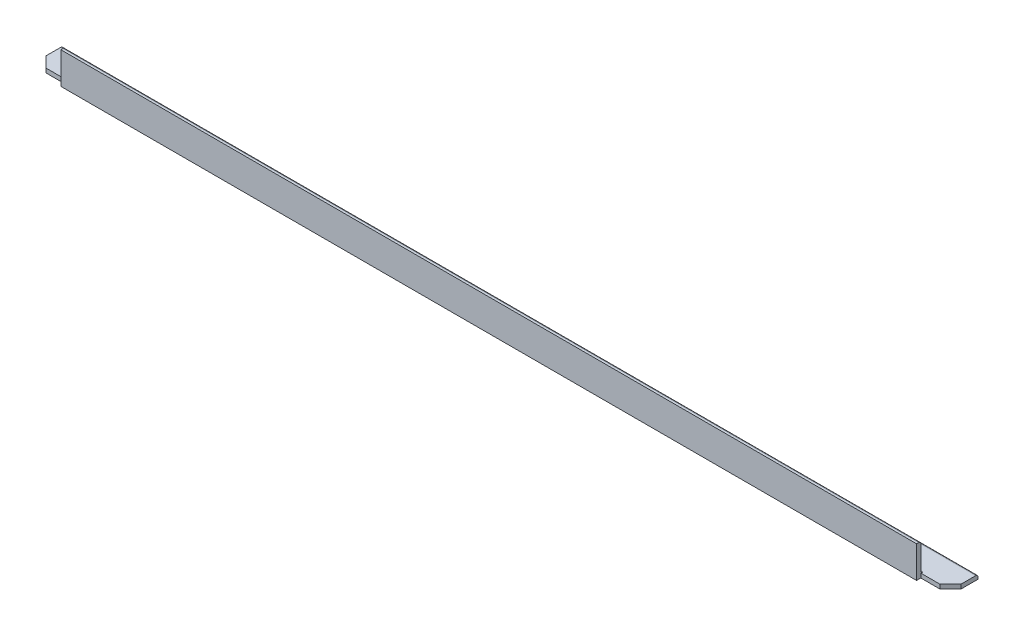
ISO-10303-21;
HEADER;
FILE_DESCRIPTION(('STEP AP214'),'2;1');
FILE_NAME('part.step','',(''),(''),'','','');
FILE_SCHEMA(('AUTOMOTIVE_DESIGN { 1 0 10303 214 1 1 1 1 }'));
ENDSEC;
DATA;
#1=APPLICATION_CONTEXT('core data for automotive mechanical design processes');
#2=APPLICATION_PROTOCOL_DEFINITION('international standard','automotive_design',2000,#1);
#3=PRODUCT_CONTEXT('',#1,'mechanical');
#4=PRODUCT('Part','Part','',(#3));
#5=PRODUCT_RELATED_PRODUCT_CATEGORY('part','',(#4));
#6=PRODUCT_DEFINITION_FORMATION('','',#4);
#7=PRODUCT_DEFINITION_CONTEXT('part definition',#1,'design');
#8=PRODUCT_DEFINITION('design','',#6,#7);
#9=PRODUCT_DEFINITION_SHAPE('','',#8);
#10=(LENGTH_UNIT() NAMED_UNIT(*) SI_UNIT(.MILLI.,.METRE.));
#11=(NAMED_UNIT(*) PLANE_ANGLE_UNIT() SI_UNIT($,.RADIAN.));
#12=(NAMED_UNIT(*) SI_UNIT($,.STERADIAN.) SOLID_ANGLE_UNIT());
#13=UNCERTAINTY_MEASURE_WITH_UNIT(LENGTH_MEASURE(1.E-05),#10,'distance_accuracy_value','');
#14=(GEOMETRIC_REPRESENTATION_CONTEXT(3) GLOBAL_UNCERTAINTY_ASSIGNED_CONTEXT((#13)) GLOBAL_UNIT_ASSIGNED_CONTEXT((#10,
#11,#12)) REPRESENTATION_CONTEXT('',''));
#15=CARTESIAN_POINT('',(0.,0.,0.));
#16=DIRECTION('',(0.,0.,1.));
#17=DIRECTION('',(1.,0.,0.));
#18=AXIS2_PLACEMENT_3D('',#15,#16,#17);
#19=CARTESIAN_POINT('',(432.,3.,-3.));
#20=DIRECTION('',(-1.,0.,0.));
#21=DIRECTION('',(0.,0.,1.));
#22=AXIS2_PLACEMENT_3D('',#19,#20,#21);
#23=CYLINDRICAL_SURFACE('',#22,1.);
#24=DIRECTION('',(-1.,0.,0.));
#25=VECTOR('',#24,1.);
#26=CARTESIAN_POINT('',(432.,2.,-3.));
#27=LINE('',#26,#25);
#28=CARTESIAN_POINT('',(418.,2.,-3.00000000000001));
#29=VERTEX_POINT('',#28);
#30=CARTESIAN_POINT('',(14.,2.,-3.));
#31=VERTEX_POINT('',#30);
#32=EDGE_CURVE('E194',#29,#31,#27,.T.);
#33=ORIENTED_EDGE('',*,*,#32,.T.);
#34=CARTESIAN_POINT('',(14.,3.,-3.));
#35=DIRECTION('',(1.,0.,0.));
#36=DIRECTION('',(0.,0.,-1.));
#37=AXIS2_PLACEMENT_3D('',#34,#35,#36);
#38=CIRCLE('',#37,1.);
#39=CARTESIAN_POINT('',(14.,3.,-2.));
#40=VERTEX_POINT('',#39);
#41=EDGE_CURVE('E298',#31,#40,#38,.F.);
#42=ORIENTED_EDGE('',*,*,#41,.T.);
#43=DIRECTION('',(-1.,0.,0.));
#44=VECTOR('',#43,1.);
#45=CARTESIAN_POINT('',(432.,3.,-2.));
#46=LINE('',#45,#44);
#47=CARTESIAN_POINT('',(418.,3.,-2.));
#48=VERTEX_POINT('',#47);
#49=EDGE_CURVE('E191',#48,#40,#46,.T.);
#50=ORIENTED_EDGE('',*,*,#49,.F.);
#51=CARTESIAN_POINT('',(418.,3.,-3.));
#52=DIRECTION('',(1.,0.,0.));
#53=DIRECTION('',(0.,0.,-1.));
#54=AXIS2_PLACEMENT_3D('',#51,#52,#53);
#55=CIRCLE('',#54,1.);
#56=EDGE_CURVE('E169',#29,#48,#55,.F.);
#57=ORIENTED_EDGE('',*,*,#56,.F.);
#58=EDGE_LOOP('',(#33,#42,#50,#57));
#59=FACE_BOUND('',#58,.T.);
#60=ADVANCED_FACE('F33',(#59),#23,.F.);
#61=CARTESIAN_POINT('',(432.,14.,-2.));
#62=DIRECTION('',(0.,0.,1.));
#63=DIRECTION('',(0.,-1.,0.));
#64=AXIS2_PLACEMENT_3D('',#61,#62,#63);
#65=PLANE('',#64);
#66=ORIENTED_EDGE('',*,*,#49,.T.);
#67=DIRECTION('',(0.,1.,0.));
#68=VECTOR('',#67,1.);
#69=CARTESIAN_POINT('',(14.,14.,-2.));
#70=LINE('',#69,#68);
#71=CARTESIAN_POINT('',(14.,14.,-2.));
#72=VERTEX_POINT('',#71);
#73=EDGE_CURVE('E295',#40,#72,#70,.T.);
#74=ORIENTED_EDGE('',*,*,#73,.T.);
#75=DIRECTION('',(-1.,0.,0.));
#76=VECTOR('',#75,1.);
#77=CARTESIAN_POINT('',(432.,14.,-2.));
#78=LINE('',#77,#76);
#79=CARTESIAN_POINT('',(418.,14.,-2.));
#80=VERTEX_POINT('',#79);
#81=EDGE_CURVE('E188',#80,#72,#78,.T.);
#82=ORIENTED_EDGE('',*,*,#81,.F.);
#83=DIRECTION('',(0.,1.,0.));
#84=VECTOR('',#83,1.);
#85=CARTESIAN_POINT('',(418.,14.,-2.));
#86=LINE('',#85,#84);
#87=EDGE_CURVE('E318',#48,#80,#86,.T.);
#88=ORIENTED_EDGE('',*,*,#87,.F.);
#89=EDGE_LOOP('',(#66,#74,#82,#88));
#90=FACE_BOUND('',#89,.T.);
#91=ADVANCED_FACE('F236',(#90),#65,.F.);
#92=CARTESIAN_POINT('',(432.,14.,-1.));
#93=DIRECTION('',(-1.,0.,0.));
#94=DIRECTION('',(0.,0.,1.));
#95=AXIS2_PLACEMENT_3D('',#92,#93,#94);
#96=CYLINDRICAL_SURFACE('',#95,1.);
#97=ORIENTED_EDGE('',*,*,#81,.T.);
#98=CARTESIAN_POINT('',(14.,14.,-1.));
#99=DIRECTION('',(1.,0.,0.));
#100=DIRECTION('',(0.,0.,-1.));
#101=AXIS2_PLACEMENT_3D('',#98,#99,#100);
#102=CIRCLE('',#101,1.);
#103=CARTESIAN_POINT('',(14.,15.,-1.));
#104=VERTEX_POINT('',#103);
#105=EDGE_CURVE('E290',#72,#104,#102,.T.);
#106=ORIENTED_EDGE('',*,*,#105,.T.);
#107=DIRECTION('',(-1.,0.,0.));
#108=VECTOR('',#107,1.);
#109=CARTESIAN_POINT('',(432.,15.,-1.));
#110=LINE('',#109,#108);
#111=CARTESIAN_POINT('',(418.,15.,-1.));
#112=VERTEX_POINT('',#111);
#113=EDGE_CURVE('E185',#112,#104,#110,.T.);
#114=ORIENTED_EDGE('',*,*,#113,.F.);
#115=CARTESIAN_POINT('',(418.,14.,-1.));
#116=DIRECTION('',(1.,0.,0.));
#117=DIRECTION('',(0.,0.,-1.));
#118=AXIS2_PLACEMENT_3D('',#115,#116,#117);
#119=CIRCLE('',#118,1.);
#120=EDGE_CURVE('E316',#80,#112,#119,.T.);
#121=ORIENTED_EDGE('',*,*,#120,.F.);
#122=EDGE_LOOP('',(#97,#106,#114,#121));
#123=FACE_BOUND('',#122,.T.);
#124=ADVANCED_FACE('F242',(#123),#96,.T.);
#125=CARTESIAN_POINT('',(432.,15.,0.));
#126=DIRECTION('',(0.,-1.,0.));
#127=DIRECTION('',(0.,0.,-1.));
#128=AXIS2_PLACEMENT_3D('',#125,#126,#127);
#129=PLANE('',#128);
#130=ORIENTED_EDGE('',*,*,#113,.T.);
#131=DIRECTION('',(0.,0.,-1.));
#132=VECTOR('',#131,1.);
#133=CARTESIAN_POINT('',(14.,15.,0.));
#134=LINE('',#133,#132);
#135=CARTESIAN_POINT('',(14.,15.,0.));
#136=VERTEX_POINT('',#135);
#137=EDGE_CURVE('E270',#136,#104,#134,.T.);
#138=ORIENTED_EDGE('',*,*,#137,.F.);
#139=DIRECTION('',(-1.,0.,0.));
#140=VECTOR('',#139,1.);
#141=CARTESIAN_POINT('',(432.,15.,0.));
#142=LINE('',#141,#140);
#143=CARTESIAN_POINT('',(418.,15.,0.));
#144=VERTEX_POINT('',#143);
#145=EDGE_CURVE('E182',#144,#136,#142,.T.);
#146=ORIENTED_EDGE('',*,*,#145,.F.);
#147=DIRECTION('',(0.,0.,1.));
#148=VECTOR('',#147,1.);
#149=CARTESIAN_POINT('',(418.,15.,-3.00000000000001));
#150=LINE('',#149,#148);
#151=EDGE_CURVE('E311',#112,#144,#150,.T.);
#152=ORIENTED_EDGE('',*,*,#151,.F.);
#153=EDGE_LOOP('',(#130,#138,#146,#152));
#154=FACE_BOUND('',#153,.T.);
#155=ADVANCED_FACE('F232',(#154),#129,.F.);
#156=CARTESIAN_POINT('',(432.,0.,0.));
#157=DIRECTION('',(0.,0.,-1.));
#158=DIRECTION('',(-1.,0.,0.));
#159=AXIS2_PLACEMENT_3D('',#156,#157,#158);
#160=PLANE('',#159);
#161=ORIENTED_EDGE('',*,*,#145,.T.);
#162=DIRECTION('',(0.,1.,0.));
#163=VECTOR('',#162,1.);
#164=CARTESIAN_POINT('',(14.,15.,0.));
#165=LINE('',#164,#163);
#166=CARTESIAN_POINT('',(14.,0.,0.));
#167=VERTEX_POINT('',#166);
#168=EDGE_CURVE('E267',#167,#136,#165,.T.);
#169=ORIENTED_EDGE('',*,*,#168,.F.);
#170=DIRECTION('',(-1.,0.,0.));
#171=VECTOR('',#170,1.);
#172=CARTESIAN_POINT('',(432.,0.,0.));
#173=LINE('',#172,#171);
#174=CARTESIAN_POINT('',(418.,0.,0.));
#175=VERTEX_POINT('',#174);
#176=EDGE_CURVE('E174',#175,#167,#173,.T.);
#177=ORIENTED_EDGE('',*,*,#176,.F.);
#178=DIRECTION('',(0.,-1.,0.));
#179=VECTOR('',#178,1.);
#180=CARTESIAN_POINT('',(418.,15.,0.));
#181=LINE('',#180,#179);
#182=EDGE_CURVE('E301',#144,#175,#181,.T.);
#183=ORIENTED_EDGE('',*,*,#182,.F.);
#184=EDGE_LOOP('',(#161,#169,#177,#183));
#185=FACE_BOUND('',#184,.T.);
#186=ADVANCED_FACE('F222',(#185),#160,.F.);
#187=CARTESIAN_POINT('',(432.,0.,0.));
#188=DIRECTION('',(0.,1.,0.));
#189=DIRECTION('',(0.,0.,1.));
#190=AXIS2_PLACEMENT_3D('',#187,#188,#189);
#191=PLANE('',#190);
#192=CARTESIAN_POINT('',(40.,0.,-8.));
#193=DIRECTION('',(0.,1.,0.));
#194=DIRECTION('',(0.,0.,1.));
#195=AXIS2_PLACEMENT_3D('',#192,#193,#194);
#196=CIRCLE('',#195,2.35000000000003);
#197=CARTESIAN_POINT('',(40.,0.,-5.64999999999997));
#198=VERTEX_POINT('',#197);
#199=EDGE_CURVE('E207',#198,#198,#196,.T.);
#200=ORIENTED_EDGE('',*,*,#199,.T.);
#201=EDGE_LOOP('',(#200));
#202=FACE_BOUND('',#201,.T.);
#203=CARTESIAN_POINT('',(392.,0.,-8.));
#204=DIRECTION('',(0.,1.,0.));
#205=DIRECTION('',(0.,0.,1.));
#206=AXIS2_PLACEMENT_3D('',#203,#204,#205);
#207=CIRCLE('',#206,2.35000000000007);
#208=CARTESIAN_POINT('',(392.,0.,-5.64999999999993));
#209=VERTEX_POINT('',#208);
#210=EDGE_CURVE('E204',#209,#209,#207,.T.);
#211=ORIENTED_EDGE('',*,*,#210,.T.);
#212=EDGE_LOOP('',(#211));
#213=FACE_BOUND('',#212,.T.);
#214=DIRECTION('',(0.,0.,-1.));
#215=VECTOR('',#214,1.);
#216=CARTESIAN_POINT('',(432.,0.,0.));
#217=LINE('',#216,#215);
#218=CARTESIAN_POINT('',(432.,0.,-7.));
#219=VERTEX_POINT('',#218);
#220=CARTESIAN_POINT('',(432.,0.,-15.));
#221=VERTEX_POINT('',#220);
#222=EDGE_CURVE('E151',#219,#221,#217,.T.);
#223=ORIENTED_EDGE('',*,*,#222,.F.);
#224=DIRECTION('',(-0.707106781186544,0.,0.707106781186551));
#225=VECTOR('',#224,1.);
#226=CARTESIAN_POINT('',(432.,0.,-7.));
#227=LINE('',#226,#225);
#228=CARTESIAN_POINT('',(427.,0.,-2.));
#229=VERTEX_POINT('',#228);
#230=EDGE_CURVE('E138',#219,#229,#227,.T.);
#231=ORIENTED_EDGE('',*,*,#230,.T.);
#232=DIRECTION('',(1.,0.,0.));
#233=VECTOR('',#232,1.);
#234=CARTESIAN_POINT('',(418.,0.,-2.));
#235=LINE('',#234,#233);
#236=CARTESIAN_POINT('',(418.,0.,-2.));
#237=VERTEX_POINT('',#236);
#238=EDGE_CURVE('E313',#237,#229,#235,.T.);
#239=ORIENTED_EDGE('',*,*,#238,.F.);
#240=DIRECTION('',(0.,0.,-1.));
#241=VECTOR('',#240,1.);
#242=CARTESIAN_POINT('',(418.,0.,0.));
#243=LINE('',#242,#241);
#244=EDGE_CURVE('E303',#175,#237,#243,.T.);
#245=ORIENTED_EDGE('',*,*,#244,.F.);
#246=ORIENTED_EDGE('',*,*,#176,.T.);
#247=DIRECTION('',(0.,0.,1.));
#248=VECTOR('',#247,1.);
#249=CARTESIAN_POINT('',(14.,0.,0.));
#250=LINE('',#249,#248);
#251=CARTESIAN_POINT('',(14.,0.,-2.));
#252=VERTEX_POINT('',#251);
#253=EDGE_CURVE('E284',#252,#167,#250,.T.);
#254=ORIENTED_EDGE('',*,*,#253,.F.);
#255=DIRECTION('',(-1.,0.,0.));
#256=VECTOR('',#255,1.);
#257=CARTESIAN_POINT('',(14.,0.,-2.));
#258=LINE('',#257,#256);
#259=CARTESIAN_POINT('',(5.,0.,-2.));
#260=VERTEX_POINT('',#259);
#261=EDGE_CURVE('E287',#252,#260,#258,.T.);
#262=ORIENTED_EDGE('',*,*,#261,.T.);
#263=DIRECTION('',(-0.707106781186548,0.,-0.707106781186547));
#264=VECTOR('',#263,1.);
#265=CARTESIAN_POINT('',(0.,0.,-7.));
#266=LINE('',#265,#264);
#267=CARTESIAN_POINT('',(0.,0.,-7.));
#268=VERTEX_POINT('',#267);
#269=EDGE_CURVE('E56',#260,#268,#266,.T.);
#270=ORIENTED_EDGE('',*,*,#269,.T.);
#271=DIRECTION('',(0.,0.,-1.));
#272=VECTOR('',#271,1.);
#273=CARTESIAN_POINT('',(0.,0.,0.));
#274=LINE('',#273,#272);
#275=CARTESIAN_POINT('',(0.,0.,-15.));
#276=VERTEX_POINT('',#275);
#277=EDGE_CURVE('E175',#268,#276,#274,.T.);
#278=ORIENTED_EDGE('',*,*,#277,.T.);
#279=DIRECTION('',(-1.,0.,0.));
#280=VECTOR('',#279,1.);
#281=CARTESIAN_POINT('',(432.,0.,-15.));
#282=LINE('',#281,#280);
#283=EDGE_CURVE('E159',#221,#276,#282,.T.);
#284=ORIENTED_EDGE('',*,*,#283,.F.);
#285=EDGE_LOOP('',(#223,#231,#239,#245,#246,#254,#262,#270,#278,#284));
#286=FACE_BOUND('',#285,.T.);
#287=ADVANCED_FACE('F157',(#202,#213,#286),#191,.F.);
#288=CARTESIAN_POINT('',(432.,1.,-15.));
#289=DIRECTION('',(0.,0.,1.));
#290=DIRECTION('',(1.,0.,0.));
#291=AXIS2_PLACEMENT_3D('',#288,#289,#290);
#292=PLANE('',#291);
#293=DIRECTION('',(0.,1.,0.));
#294=VECTOR('',#293,1.);
#295=CARTESIAN_POINT('',(0.,1.,-15.));
#296=LINE('',#295,#294);
#297=CARTESIAN_POINT('',(0.,1.,-15.));
#298=VERTEX_POINT('',#297);
#299=EDGE_CURVE('E177',#276,#298,#296,.T.);
#300=ORIENTED_EDGE('',*,*,#299,.T.);
#301=DIRECTION('',(-1.,0.,0.));
#302=VECTOR('',#301,1.);
#303=CARTESIAN_POINT('',(432.,1.,-15.));
#304=LINE('',#303,#302);
#305=CARTESIAN_POINT('',(432.,1.,-15.));
#306=VERTEX_POINT('',#305);
#307=EDGE_CURVE('E200',#306,#298,#304,.T.);
#308=ORIENTED_EDGE('',*,*,#307,.F.);
#309=DIRECTION('',(0.,1.,0.));
#310=VECTOR('',#309,1.);
#311=CARTESIAN_POINT('',(432.,1.,-15.));
#312=LINE('',#311,#310);
#313=EDGE_CURVE('E160',#221,#306,#312,.T.);
#314=ORIENTED_EDGE('',*,*,#313,.F.);
#315=ORIENTED_EDGE('',*,*,#283,.T.);
#316=EDGE_LOOP('',(#300,#308,#314,#315));
#317=FACE_BOUND('',#316,.T.);
#318=ADVANCED_FACE('F221',(#317),#292,.F.);
#319=CARTESIAN_POINT('',(432.,1.,-14.));
#320=DIRECTION('',(-1.,0.,0.));
#321=DIRECTION('',(0.,0.,1.));
#322=AXIS2_PLACEMENT_3D('',#319,#320,#321);
#323=CYLINDRICAL_SURFACE('',#322,1.);
#324=CARTESIAN_POINT('',(0.,1.,-14.));
#325=DIRECTION('',(1.,0.,0.));
#326=DIRECTION('',(0.,0.,1.));
#327=AXIS2_PLACEMENT_3D('',#324,#325,#326);
#328=CIRCLE('',#327,1.);
#329=CARTESIAN_POINT('',(0.,2.,-14.));
#330=VERTEX_POINT('',#329);
#331=EDGE_CURVE('E166',#298,#330,#328,.T.);
#332=ORIENTED_EDGE('',*,*,#331,.T.);
#333=DIRECTION('',(-1.,0.,0.));
#334=VECTOR('',#333,1.);
#335=CARTESIAN_POINT('',(432.,2.,-14.));
#336=LINE('',#335,#334);
#337=CARTESIAN_POINT('',(432.,2.,-14.));
#338=VERTEX_POINT('',#337);
#339=EDGE_CURVE('E197',#338,#330,#336,.T.);
#340=ORIENTED_EDGE('',*,*,#339,.F.);
#341=CARTESIAN_POINT('',(432.,1.,-14.));
#342=DIRECTION('',(1.,0.,0.));
#343=DIRECTION('',(0.,0.,1.));
#344=AXIS2_PLACEMENT_3D('',#341,#342,#343);
#345=CIRCLE('',#344,1.);
#346=EDGE_CURVE('E163',#306,#338,#345,.T.);
#347=ORIENTED_EDGE('',*,*,#346,.F.);
#348=ORIENTED_EDGE('',*,*,#307,.T.);
#349=EDGE_LOOP('',(#332,#340,#347,#348));
#350=FACE_BOUND('',#349,.T.);
#351=ADVANCED_FACE('F229',(#350),#323,.T.);
#352=CARTESIAN_POINT('',(432.,2.,-3.));
#353=DIRECTION('',(0.,-1.,0.));
#354=DIRECTION('',(0.,0.,-1.));
#355=AXIS2_PLACEMENT_3D('',#352,#353,#354);
#356=PLANE('',#355);
#357=CARTESIAN_POINT('',(40.,2.,-8.));
#358=DIRECTION('',(0.,-1.,0.));
#359=DIRECTION('',(0.,0.,-1.));
#360=AXIS2_PLACEMENT_3D('',#357,#358,#359);
#361=CIRCLE('',#360,4.35000000000001);
#362=CARTESIAN_POINT('',(40.,2.,-12.35));
#363=VERTEX_POINT('',#362);
#364=EDGE_CURVE('E11',#363,#363,#361,.T.);
#365=ORIENTED_EDGE('',*,*,#364,.T.);
#366=EDGE_LOOP('',(#365));
#367=FACE_BOUND('',#366,.T.);
#368=CARTESIAN_POINT('',(392.,2.,-8.));
#369=DIRECTION('',(0.,-1.,0.));
#370=DIRECTION('',(0.,0.,-1.));
#371=AXIS2_PLACEMENT_3D('',#368,#369,#370);
#372=CIRCLE('',#371,4.35000000000005);
#373=CARTESIAN_POINT('',(392.,2.,-12.35));
#374=VERTEX_POINT('',#373);
#375=EDGE_CURVE('E41',#374,#374,#372,.T.);
#376=ORIENTED_EDGE('',*,*,#375,.T.);
#377=EDGE_LOOP('',(#376));
#378=FACE_BOUND('',#377,.T.);
#379=DIRECTION('',(1.,0.,0.));
#380=VECTOR('',#379,1.);
#381=CARTESIAN_POINT('',(418.,2.,-2.));
#382=LINE('',#381,#380);
#383=CARTESIAN_POINT('',(418.,2.,-2.));
#384=VERTEX_POINT('',#383);
#385=CARTESIAN_POINT('',(427.,2.,-2.));
#386=VERTEX_POINT('',#385);
#387=EDGE_CURVE('E314',#384,#386,#382,.T.);
#388=ORIENTED_EDGE('',*,*,#387,.T.);
#389=DIRECTION('',(-0.707106781186544,0.,0.707106781186551));
#390=VECTOR('',#389,1.);
#391=CARTESIAN_POINT('',(432.,2.,-7.));
#392=LINE('',#391,#390);
#393=CARTESIAN_POINT('',(432.,2.,-7.));
#394=VERTEX_POINT('',#393);
#395=EDGE_CURVE('E48',#394,#386,#392,.T.);
#396=ORIENTED_EDGE('',*,*,#395,.F.);
#397=DIRECTION('',(0.,0.,1.));
#398=VECTOR('',#397,1.);
#399=CARTESIAN_POINT('',(432.,2.,-3.));
#400=LINE('',#399,#398);
#401=EDGE_CURVE('E154',#338,#394,#400,.T.);
#402=ORIENTED_EDGE('',*,*,#401,.F.);
#403=ORIENTED_EDGE('',*,*,#339,.T.);
#404=DIRECTION('',(0.,0.,1.));
#405=VECTOR('',#404,1.);
#406=CARTESIAN_POINT('',(0.,2.,-3.));
#407=LINE('',#406,#405);
#408=CARTESIAN_POINT('',(0.,2.,-7.));
#409=VERTEX_POINT('',#408);
#410=EDGE_CURVE('E161',#330,#409,#407,.T.);
#411=ORIENTED_EDGE('',*,*,#410,.T.);
#412=DIRECTION('',(-0.707106781186548,0.,-0.707106781186547));
#413=VECTOR('',#412,1.);
#414=CARTESIAN_POINT('',(0.,2.,-7.));
#415=LINE('',#414,#413);
#416=CARTESIAN_POINT('',(5.,2.,-2.));
#417=VERTEX_POINT('',#416);
#418=EDGE_CURVE('E274',#417,#409,#415,.T.);
#419=ORIENTED_EDGE('',*,*,#418,.F.);
#420=DIRECTION('',(-1.,0.,0.));
#421=VECTOR('',#420,1.);
#422=CARTESIAN_POINT('',(14.,2.,-2.));
#423=LINE('',#422,#421);
#424=CARTESIAN_POINT('',(14.,2.,-2.));
#425=VERTEX_POINT('',#424);
#426=EDGE_CURVE('E286',#425,#417,#423,.T.);
#427=ORIENTED_EDGE('',*,*,#426,.F.);
#428=DIRECTION('',(0.,0.,1.));
#429=VECTOR('',#428,1.);
#430=CARTESIAN_POINT('',(14.,2.,-3.));
#431=LINE('',#430,#429);
#432=EDGE_CURVE('E278',#31,#425,#431,.T.);
#433=ORIENTED_EDGE('',*,*,#432,.F.);
#434=ORIENTED_EDGE('',*,*,#32,.F.);
#435=DIRECTION('',(0.,0.,-1.));
#436=VECTOR('',#435,1.);
#437=CARTESIAN_POINT('',(418.,2.,-2.));
#438=LINE('',#437,#436);
#439=EDGE_CURVE('E309',#384,#29,#438,.T.);
#440=ORIENTED_EDGE('',*,*,#439,.F.);
#441=EDGE_LOOP('',(#388,#396,#402,#403,#411,#419,#427,#433,#434,#440));
#442=FACE_BOUND('',#441,.T.);
#443=ADVANCED_FACE('F212',(#367,#378,#442),#356,.F.);
#444=CARTESIAN_POINT('',(432.,1.,-14.));
#445=DIRECTION('',(-1.,0.,0.));
#446=DIRECTION('',(0.,0.,1.));
#447=AXIS2_PLACEMENT_3D('',#444,#445,#446);
#448=PLANE('',#447);
#449=ORIENTED_EDGE('',*,*,#401,.T.);
#450=DIRECTION('',(0.,1.,0.));
#451=VECTOR('',#450,1.);
#452=CARTESIAN_POINT('',(432.,0.,-7.));
#453=LINE('',#452,#451);
#454=EDGE_CURVE('E141',#219,#394,#453,.T.);
#455=ORIENTED_EDGE('',*,*,#454,.F.);
#456=ORIENTED_EDGE('',*,*,#222,.T.);
#457=ORIENTED_EDGE('',*,*,#313,.T.);
#458=ORIENTED_EDGE('',*,*,#346,.T.);
#459=EDGE_LOOP('',(#449,#455,#456,#457,#458));
#460=FACE_BOUND('',#459,.T.);
#461=ADVANCED_FACE('F150',(#460),#448,.F.);
#462=CARTESIAN_POINT('',(0.,1.,-14.));
#463=DIRECTION('',(-1.,0.,0.));
#464=DIRECTION('',(0.,0.,1.));
#465=AXIS2_PLACEMENT_3D('',#462,#463,#464);
#466=PLANE('',#465);
#467=DIRECTION('',(0.,1.,0.));
#468=VECTOR('',#467,1.);
#469=CARTESIAN_POINT('',(0.,0.,-7.));
#470=LINE('',#469,#468);
#471=EDGE_CURVE('E266',#268,#409,#470,.T.);
#472=ORIENTED_EDGE('',*,*,#471,.T.);
#473=ORIENTED_EDGE('',*,*,#410,.F.);
#474=ORIENTED_EDGE('',*,*,#331,.F.);
#475=ORIENTED_EDGE('',*,*,#299,.F.);
#476=ORIENTED_EDGE('',*,*,#277,.F.);
#477=EDGE_LOOP('',(#472,#473,#474,#475,#476));
#478=FACE_BOUND('',#477,.T.);
#479=ADVANCED_FACE('F264',(#478),#466,.T.);
#480=CARTESIAN_POINT('',(418.,0.,0.));
#481=DIRECTION('',(1.,0.,0.));
#482=DIRECTION('',(0.,0.,-1.));
#483=AXIS2_PLACEMENT_3D('',#480,#481,#482);
#484=PLANE('',#483);
#485=ORIENTED_EDGE('',*,*,#56,.T.);
#486=ORIENTED_EDGE('',*,*,#87,.T.);
#487=ORIENTED_EDGE('',*,*,#120,.T.);
#488=ORIENTED_EDGE('',*,*,#151,.T.);
#489=ORIENTED_EDGE('',*,*,#182,.T.);
#490=ORIENTED_EDGE('',*,*,#244,.T.);
#491=DIRECTION('',(0.,1.,0.));
#492=VECTOR('',#491,1.);
#493=CARTESIAN_POINT('',(418.,0.,-2.));
#494=LINE('',#493,#492);
#495=EDGE_CURVE('E306',#237,#384,#494,.T.);
#496=ORIENTED_EDGE('',*,*,#495,.T.);
#497=ORIENTED_EDGE('',*,*,#439,.T.);
#498=EDGE_LOOP('',(#485,#486,#487,#488,#489,#490,#496,#497));
#499=FACE_BOUND('',#498,.T.);
#500=ADVANCED_FACE('F323',(#499),#484,.T.);
#501=CARTESIAN_POINT('',(418.,0.,-2.));
#502=DIRECTION('',(0.,0.,-1.));
#503=DIRECTION('',(-1.,0.,0.));
#504=AXIS2_PLACEMENT_3D('',#501,#502,#503);
#505=PLANE('',#504);
#506=ORIENTED_EDGE('',*,*,#238,.T.);
#507=DIRECTION('',(0.,1.,0.));
#508=VECTOR('',#507,1.);
#509=CARTESIAN_POINT('',(427.,0.,-2.));
#510=LINE('',#509,#508);
#511=EDGE_CURVE('E142',#229,#386,#510,.T.);
#512=ORIENTED_EDGE('',*,*,#511,.T.);
#513=ORIENTED_EDGE('',*,*,#387,.F.);
#514=ORIENTED_EDGE('',*,*,#495,.F.);
#515=EDGE_LOOP('',(#506,#512,#513,#514));
#516=FACE_BOUND('',#515,.T.);
#517=ADVANCED_FACE('F346',(#516),#505,.F.);
#518=CARTESIAN_POINT('',(14.,0.,0.));
#519=DIRECTION('',(1.,0.,0.));
#520=DIRECTION('',(0.,0.,-1.));
#521=AXIS2_PLACEMENT_3D('',#518,#519,#520);
#522=PLANE('',#521);
#523=ORIENTED_EDGE('',*,*,#432,.T.);
#524=DIRECTION('',(0.,-1.,0.));
#525=VECTOR('',#524,1.);
#526=CARTESIAN_POINT('',(14.,2.,-2.));
#527=LINE('',#526,#525);
#528=EDGE_CURVE('E281',#425,#252,#527,.T.);
#529=ORIENTED_EDGE('',*,*,#528,.T.);
#530=ORIENTED_EDGE('',*,*,#253,.T.);
#531=ORIENTED_EDGE('',*,*,#168,.T.);
#532=ORIENTED_EDGE('',*,*,#137,.T.);
#533=ORIENTED_EDGE('',*,*,#105,.F.);
#534=ORIENTED_EDGE('',*,*,#73,.F.);
#535=ORIENTED_EDGE('',*,*,#41,.F.);
#536=EDGE_LOOP('',(#523,#529,#530,#531,#532,#533,#534,#535));
#537=FACE_BOUND('',#536,.T.);
#538=ADVANCED_FACE('F330',(#537),#522,.F.);
#539=CARTESIAN_POINT('',(14.,2.,-2.));
#540=DIRECTION('',(0.,0.,-1.));
#541=DIRECTION('',(-1.,0.,0.));
#542=AXIS2_PLACEMENT_3D('',#539,#540,#541);
#543=PLANE('',#542);
#544=ORIENTED_EDGE('',*,*,#426,.T.);
#545=DIRECTION('',(0.,1.,0.));
#546=VECTOR('',#545,1.);
#547=CARTESIAN_POINT('',(5.,0.,-2.));
#548=LINE('',#547,#546);
#549=EDGE_CURVE('E268',#260,#417,#548,.T.);
#550=ORIENTED_EDGE('',*,*,#549,.F.);
#551=ORIENTED_EDGE('',*,*,#261,.F.);
#552=ORIENTED_EDGE('',*,*,#528,.F.);
#553=EDGE_LOOP('',(#544,#550,#551,#552));
#554=FACE_BOUND('',#553,.T.);
#555=ADVANCED_FACE('F333',(#554),#543,.F.);
#556=CARTESIAN_POINT('',(0.,0.,-7.));
#557=DIRECTION('',(0.707106781186547,0.,-0.707106781186548));
#558=DIRECTION('',(-0.707106781186548,0.,-0.707106781186547));
#559=AXIS2_PLACEMENT_3D('',#556,#557,#558);
#560=PLANE('',#559);
#561=ORIENTED_EDGE('',*,*,#418,.T.);
#562=ORIENTED_EDGE('',*,*,#471,.F.);
#563=ORIENTED_EDGE('',*,*,#269,.F.);
#564=ORIENTED_EDGE('',*,*,#549,.T.);
#565=EDGE_LOOP('',(#561,#562,#563,#564));
#566=FACE_BOUND('',#565,.T.);
#567=ADVANCED_FACE('F349',(#566),#560,.F.);
#568=CARTESIAN_POINT('',(432.,0.,-7.));
#569=DIRECTION('',(-0.707106781186551,0.,-0.707106781186544));
#570=DIRECTION('',(-0.707106781186544,0.,0.707106781186551));
#571=AXIS2_PLACEMENT_3D('',#568,#569,#570);
#572=PLANE('',#571);
#573=ORIENTED_EDGE('',*,*,#395,.T.);
#574=ORIENTED_EDGE('',*,*,#511,.F.);
#575=ORIENTED_EDGE('',*,*,#230,.F.);
#576=ORIENTED_EDGE('',*,*,#454,.T.);
#577=EDGE_LOOP('',(#573,#574,#575,#576));
#578=FACE_BOUND('',#577,.T.);
#579=ADVANCED_FACE('F140',(#578),#572,.F.);
#580=CARTESIAN_POINT('',(40.,-0.0500000000000355,-8.));
#581=DIRECTION('',(0.,1.,0.));
#582=DIRECTION('',(0.,0.,1.));
#583=AXIS2_PLACEMENT_3D('',#580,#581,#582);
#584=CONICAL_SURFACE('',#583,2.3,0.785398163397443);
#585=ORIENTED_EDGE('',*,*,#364,.F.);
#586=EDGE_LOOP('',(#585));
#587=FACE_BOUND('',#586,.T.);
#588=ORIENTED_EDGE('',*,*,#199,.F.);
#589=EDGE_LOOP('',(#588));
#590=FACE_BOUND('',#589,.T.);
#591=ADVANCED_FACE('F217',(#587,#590),#584,.F.);
#592=CARTESIAN_POINT('',(392.,-0.0500000000000355,-8.));
#593=DIRECTION('',(0.,1.,0.));
#594=DIRECTION('',(0.,0.,1.));
#595=AXIS2_PLACEMENT_3D('',#592,#593,#594);
#596=CONICAL_SURFACE('',#595,2.30000000000003,0.785398163397443);
#597=ORIENTED_EDGE('',*,*,#375,.F.);
#598=EDGE_LOOP('',(#597));
#599=FACE_BOUND('',#598,.T.);
#600=ORIENTED_EDGE('',*,*,#210,.F.);
#601=EDGE_LOOP('',(#600));
#602=FACE_BOUND('',#601,.T.);
#603=ADVANCED_FACE('F35',(#599,#602),#596,.F.);
#604=CLOSED_SHELL('',(#60,#91,#124,#155,#186,#287,#318,#351,#443,#461,#479,#500,#517,#538,#555,
#567,#579,#591,#603));
#605=MANIFOLD_SOLID_BREP('B2',#604);
#606=ADVANCED_BREP_SHAPE_REPRESENTATION('',(#18,#605),#14);
#607=SHAPE_DEFINITION_REPRESENTATION(#9,#606);
ENDSEC;
END-ISO-10303-21;
